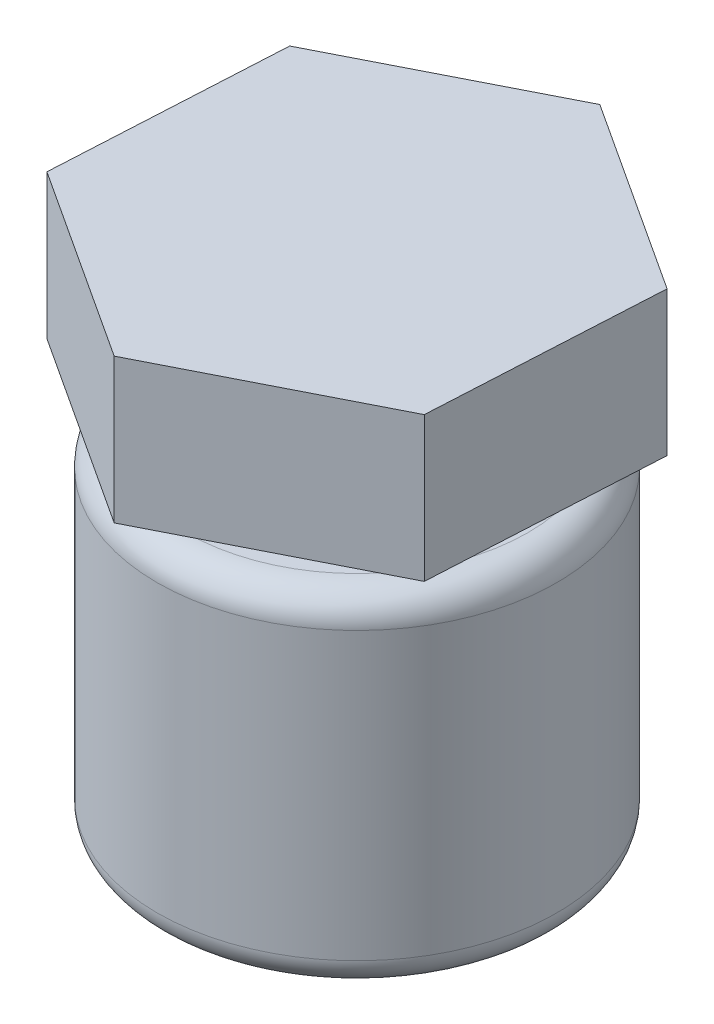
ISO-10303-21;
HEADER;
FILE_DESCRIPTION(('STEP AP214'),'2;1');
FILE_NAME('part.step','',(''),(''),'','','');
FILE_SCHEMA(('AUTOMOTIVE_DESIGN { 1 0 10303 214 1 1 1 1 }'));
ENDSEC;
DATA;
#1=APPLICATION_CONTEXT('core data for automotive mechanical design processes');
#2=APPLICATION_PROTOCOL_DEFINITION('international standard','automotive_design',2000,#1);
#3=PRODUCT_CONTEXT('',#1,'mechanical');
#4=PRODUCT('Part','Part','',(#3));
#5=PRODUCT_RELATED_PRODUCT_CATEGORY('part','',(#4));
#6=PRODUCT_DEFINITION_FORMATION('','',#4);
#7=PRODUCT_DEFINITION_CONTEXT('part definition',#1,'design');
#8=PRODUCT_DEFINITION('design','',#6,#7);
#9=PRODUCT_DEFINITION_SHAPE('','',#8);
#10=(LENGTH_UNIT() NAMED_UNIT(*) SI_UNIT(.MILLI.,.METRE.));
#11=(NAMED_UNIT(*) PLANE_ANGLE_UNIT() SI_UNIT($,.RADIAN.));
#12=(NAMED_UNIT(*) SI_UNIT($,.STERADIAN.) SOLID_ANGLE_UNIT());
#13=UNCERTAINTY_MEASURE_WITH_UNIT(LENGTH_MEASURE(1.E-05),#10,'distance_accuracy_value','');
#14=(GEOMETRIC_REPRESENTATION_CONTEXT(3) GLOBAL_UNCERTAINTY_ASSIGNED_CONTEXT((#13)) GLOBAL_UNIT_ASSIGNED_CONTEXT((#10,
#11,#12)) REPRESENTATION_CONTEXT('',''));
#15=CARTESIAN_POINT('',(0.,0.,0.));
#16=DIRECTION('',(0.,0.,1.));
#17=DIRECTION('',(1.,0.,0.));
#18=AXIS2_PLACEMENT_3D('',#15,#16,#17);
#19=CARTESIAN_POINT('',(66.8907082208874,83.6872796662249,43.6013341927026));
#20=DIRECTION('',(-0.998539035272243,0.,-0.0540351278112464));
#21=DIRECTION('',(-0.0540351278112464,0.,0.998539035272243));
#22=AXIS2_PLACEMENT_3D('',#19,#20,#21);
#23=PLANE('',#22);
#24=DIRECTION('',(0.0540351278112464,0.,-0.998539035272243));
#25=VECTOR('',#24,1.);
#26=CARTESIAN_POINT('',(66.8907082208874,33.6872796662249,43.6013341927026));
#27=LINE('',#26,#25);
#28=CARTESIAN_POINT('',(66.8907082208874,33.6872796662249,43.6013341927026));
#29=VERTEX_POINT('',#28);
#30=CARTESIAN_POINT('',(71.2052171602192,33.6872796662249,-36.1283855000698));
#31=VERTEX_POINT('',#30);
#32=EDGE_CURVE('E131',#29,#31,#27,.T.);
#33=ORIENTED_EDGE('',*,*,#32,.T.);
#34=DIRECTION('',(0.,-1.,0.));
#35=VECTOR('',#34,1.);
#36=CARTESIAN_POINT('',(71.2052171602192,83.6872796662249,-36.1283855000698));
#37=LINE('',#36,#35);
#38=CARTESIAN_POINT('',(71.2052171602192,83.6872796662249,-36.1283855000698));
#39=VERTEX_POINT('',#38);
#40=EDGE_CURVE('E12',#39,#31,#37,.T.);
#41=ORIENTED_EDGE('',*,*,#40,.F.);
#42=DIRECTION('',(0.0540351278112464,0.,-0.998539035272243));
#43=VECTOR('',#42,1.);
#44=CARTESIAN_POINT('',(66.8907082208874,83.6872796662249,43.6013341927026));
#45=LINE('',#44,#43);
#46=CARTESIAN_POINT('',(66.8907082208874,83.6872796662249,43.6013341927026));
#47=VERTEX_POINT('',#46);
#48=EDGE_CURVE('E142',#47,#39,#45,.T.);
#49=ORIENTED_EDGE('',*,*,#48,.F.);
#50=DIRECTION('',(0.,-1.,0.));
#51=VECTOR('',#50,1.);
#52=CARTESIAN_POINT('',(66.8907082208874,83.6872796662249,43.6013341927026));
#53=LINE('',#52,#51);
#54=EDGE_CURVE('E127',#47,#29,#53,.T.);
#55=ORIENTED_EDGE('',*,*,#54,.T.);
#56=EDGE_LOOP('',(#33,#41,#49,#55));
#57=FACE_BOUND('',#56,.T.);
#58=ADVANCED_FACE('F47',(#57),#23,.F.);
#59=CARTESIAN_POINT('',(71.2052171602192,83.6872796662249,-36.1283855000698));
#60=DIRECTION('',(-0.546065311017401,0.,0.837742607310545));
#61=DIRECTION('',(0.837742607310545,0.,0.546065311017401));
#62=AXIS2_PLACEMENT_3D('',#59,#60,#61);
#63=PLANE('',#62);
#64=DIRECTION('',(-0.837742607310545,0.,-0.546065311017401));
#65=VECTOR('',#64,1.);
#66=CARTESIAN_POINT('',(71.2052171602192,33.6872796662249,-36.1283855000698));
#67=LINE('',#66,#65);
#68=CARTESIAN_POINT('',(4.31450893933181,33.6872796662249,-79.7297196927724));
#69=VERTEX_POINT('',#68);
#70=EDGE_CURVE('E134',#31,#69,#67,.T.);
#71=ORIENTED_EDGE('',*,*,#70,.T.);
#72=DIRECTION('',(0.,-1.,0.));
#73=VECTOR('',#72,1.);
#74=CARTESIAN_POINT('',(4.31450893933181,83.6872796662249,-79.7297196927724));
#75=LINE('',#74,#73);
#76=CARTESIAN_POINT('',(4.31450893933181,83.6872796662249,-79.7297196927724));
#77=VERTEX_POINT('',#76);
#78=EDGE_CURVE('E55',#77,#69,#75,.T.);
#79=ORIENTED_EDGE('',*,*,#78,.F.);
#80=DIRECTION('',(-0.837742607310545,0.,-0.546065311017401));
#81=VECTOR('',#80,1.);
#82=CARTESIAN_POINT('',(71.2052171602192,83.6872796662249,-36.1283855000698));
#83=LINE('',#82,#81);
#84=EDGE_CURVE('E100',#39,#77,#83,.T.);
#85=ORIENTED_EDGE('',*,*,#84,.F.);
#86=ORIENTED_EDGE('',*,*,#40,.T.);
#87=EDGE_LOOP('',(#71,#79,#85,#86));
#88=FACE_BOUND('',#87,.T.);
#89=ADVANCED_FACE('F167',(#88),#63,.F.);
#90=CARTESIAN_POINT('',(4.31450893933181,83.6872796662249,-79.7297196927724));
#91=DIRECTION('',(0.452473724254843,0.,0.891777735121792));
#92=DIRECTION('',(0.891777735121792,0.,-0.452473724254843));
#93=AXIS2_PLACEMENT_3D('',#90,#91,#92);
#94=PLANE('',#93);
#95=DIRECTION('',(-0.891777735121792,0.,0.452473724254843));
#96=VECTOR('',#95,1.);
#97=CARTESIAN_POINT('',(4.31450893933181,33.6872796662249,-79.7297196927724));
#98=LINE('',#97,#96);
#99=CARTESIAN_POINT('',(-66.8907082208874,33.6872796662249,-43.6013341927026));
#100=VERTEX_POINT('',#99);
#101=EDGE_CURVE('E137',#69,#100,#98,.T.);
#102=ORIENTED_EDGE('',*,*,#101,.T.);
#103=DIRECTION('',(0.,-1.,0.));
#104=VECTOR('',#103,1.);
#105=CARTESIAN_POINT('',(-66.8907082208874,83.6872796662249,-43.6013341927026));
#106=LINE('',#105,#104);
#107=CARTESIAN_POINT('',(-66.8907082208874,83.6872796662249,-43.6013341927026));
#108=VERTEX_POINT('',#107);
#109=EDGE_CURVE('E122',#108,#100,#106,.T.);
#110=ORIENTED_EDGE('',*,*,#109,.F.);
#111=DIRECTION('',(-0.891777735121792,0.,0.452473724254843));
#112=VECTOR('',#111,1.);
#113=CARTESIAN_POINT('',(4.31450893933181,83.6872796662249,-79.7297196927724));
#114=LINE('',#113,#112);
#115=EDGE_CURVE('E113',#77,#108,#114,.T.);
#116=ORIENTED_EDGE('',*,*,#115,.F.);
#117=ORIENTED_EDGE('',*,*,#78,.T.);
#118=EDGE_LOOP('',(#102,#110,#116,#117));
#119=FACE_BOUND('',#118,.T.);
#120=ADVANCED_FACE('F148',(#119),#94,.F.);
#121=CARTESIAN_POINT('',(-66.8907082208874,83.6872796662249,-43.6013341927026));
#122=DIRECTION('',(0.998539035272243,0.,0.0540351278112467));
#123=DIRECTION('',(0.0540351278112468,0.,-0.998539035272243));
#124=AXIS2_PLACEMENT_3D('',#121,#122,#123);
#125=PLANE('',#124);
#126=DIRECTION('',(-0.0540351278112468,0.,0.998539035272243));
#127=VECTOR('',#126,1.);
#128=CARTESIAN_POINT('',(-66.8907082208874,33.6872796662249,-43.6013341927026));
#129=LINE('',#128,#127);
#130=CARTESIAN_POINT('',(-71.2052171602192,33.6872796662249,36.1283855000698));
#131=VERTEX_POINT('',#130);
#132=EDGE_CURVE('E121',#100,#131,#129,.T.);
#133=ORIENTED_EDGE('',*,*,#132,.T.);
#134=DIRECTION('',(0.,-1.,0.));
#135=VECTOR('',#134,1.);
#136=CARTESIAN_POINT('',(-71.2052171602192,83.6872796662249,36.1283855000698));
#137=LINE('',#136,#135);
#138=CARTESIAN_POINT('',(-71.2052171602192,83.6872796662249,36.1283855000698));
#139=VERTEX_POINT('',#138);
#140=EDGE_CURVE('E118',#139,#131,#137,.T.);
#141=ORIENTED_EDGE('',*,*,#140,.F.);
#142=DIRECTION('',(-0.0540351278112468,0.,0.998539035272243));
#143=VECTOR('',#142,1.);
#144=CARTESIAN_POINT('',(-66.8907082208874,83.6872796662249,-43.6013341927026));
#145=LINE('',#144,#143);
#146=EDGE_CURVE('E107',#108,#139,#145,.T.);
#147=ORIENTED_EDGE('',*,*,#146,.F.);
#148=ORIENTED_EDGE('',*,*,#109,.T.);
#149=EDGE_LOOP('',(#133,#141,#147,#148));
#150=FACE_BOUND('',#149,.T.);
#151=ADVANCED_FACE('F119',(#150),#125,.F.);
#152=CARTESIAN_POINT('',(-71.2052171602192,83.6872796662249,36.1283855000698));
#153=DIRECTION('',(0.5460653110174,0.,-0.837742607310545));
#154=DIRECTION('',(-0.837742607310545,0.,-0.5460653110174));
#155=AXIS2_PLACEMENT_3D('',#152,#153,#154);
#156=PLANE('',#155);
#157=DIRECTION('',(0.837742607310545,0.,0.5460653110174));
#158=VECTOR('',#157,1.);
#159=CARTESIAN_POINT('',(-71.2052171602192,33.6872796662249,36.1283855000698));
#160=LINE('',#159,#158);
#161=CARTESIAN_POINT('',(-4.31450893933173,33.6872796662249,79.7297196927724));
#162=VERTEX_POINT('',#161);
#163=EDGE_CURVE('E86',#131,#162,#160,.T.);
#164=ORIENTED_EDGE('',*,*,#163,.T.);
#165=DIRECTION('',(0.,-1.,0.));
#166=VECTOR('',#165,1.);
#167=CARTESIAN_POINT('',(-4.31450893933173,83.6872796662249,79.7297196927724));
#168=LINE('',#167,#166);
#169=CARTESIAN_POINT('',(-4.31450893933173,83.6872796662249,79.7297196927724));
#170=VERTEX_POINT('',#169);
#171=EDGE_CURVE('E123',#170,#162,#168,.T.);
#172=ORIENTED_EDGE('',*,*,#171,.F.);
#173=DIRECTION('',(0.837742607310545,0.,0.5460653110174));
#174=VECTOR('',#173,1.);
#175=CARTESIAN_POINT('',(-71.2052171602192,83.6872796662249,36.1283855000698));
#176=LINE('',#175,#174);
#177=EDGE_CURVE('E111',#139,#170,#176,.T.);
#178=ORIENTED_EDGE('',*,*,#177,.F.);
#179=ORIENTED_EDGE('',*,*,#140,.T.);
#180=EDGE_LOOP('',(#164,#172,#178,#179));
#181=FACE_BOUND('',#180,.T.);
#182=ADVANCED_FACE('F125',(#181),#156,.F.);
#183=CARTESIAN_POINT('',(-4.31450893933173,83.6872796662249,79.7297196927724));
#184=DIRECTION('',(-0.452473724254843,0.,-0.891777735121792));
#185=DIRECTION('',(-0.891777735121792,0.,0.452473724254843));
#186=AXIS2_PLACEMENT_3D('',#183,#184,#185);
#187=PLANE('',#186);
#188=DIRECTION('',(0.891777735121792,0.,-0.452473724254843));
#189=VECTOR('',#188,1.);
#190=CARTESIAN_POINT('',(-4.31450893933173,33.6872796662249,79.7297196927724));
#191=LINE('',#190,#189);
#192=EDGE_CURVE('E92',#162,#29,#191,.T.);
#193=ORIENTED_EDGE('',*,*,#192,.T.);
#194=ORIENTED_EDGE('',*,*,#54,.F.);
#195=DIRECTION('',(0.891777735121792,0.,-0.452473724254843));
#196=VECTOR('',#195,1.);
#197=CARTESIAN_POINT('',(-4.31450893933173,83.6872796662249,79.7297196927724));
#198=LINE('',#197,#196);
#199=EDGE_CURVE('E63',#170,#47,#198,.T.);
#200=ORIENTED_EDGE('',*,*,#199,.F.);
#201=ORIENTED_EDGE('',*,*,#171,.T.);
#202=EDGE_LOOP('',(#193,#194,#200,#201));
#203=FACE_BOUND('',#202,.T.);
#204=ADVANCED_FACE('F156',(#203),#187,.F.);
#205=CARTESIAN_POINT('',(0.,83.6872796662249,0.));
#206=DIRECTION('',(0.,1.,0.));
#207=DIRECTION('',(0.,0.,1.));
#208=AXIS2_PLACEMENT_3D('',#205,#206,#207);
#209=PLANE('',#208);
#210=ORIENTED_EDGE('',*,*,#48,.T.);
#211=ORIENTED_EDGE('',*,*,#84,.T.);
#212=ORIENTED_EDGE('',*,*,#115,.T.);
#213=ORIENTED_EDGE('',*,*,#146,.T.);
#214=ORIENTED_EDGE('',*,*,#177,.T.);
#215=ORIENTED_EDGE('',*,*,#199,.T.);
#216=EDGE_LOOP('',(#210,#211,#212,#213,#214,#215));
#217=FACE_BOUND('',#216,.T.);
#218=ADVANCED_FACE('F109',(#217),#209,.T.);
#219=CARTESIAN_POINT('',(0.,33.6872796662249,0.));
#220=DIRECTION('',(0.,1.,0.));
#221=DIRECTION('',(0.,0.,1.));
#222=AXIS2_PLACEMENT_3D('',#219,#220,#221);
#223=PLANE('',#222);
#224=ORIENTED_EDGE('',*,*,#32,.F.);
#225=ORIENTED_EDGE('',*,*,#192,.F.);
#226=ORIENTED_EDGE('',*,*,#163,.F.);
#227=ORIENTED_EDGE('',*,*,#132,.F.);
#228=ORIENTED_EDGE('',*,*,#101,.F.);
#229=ORIENTED_EDGE('',*,*,#70,.F.);
#230=EDGE_LOOP('',(#224,#225,#226,#227,#228,#229));
#231=FACE_BOUND('',#230,.T.);
#232=CARTESIAN_POINT('',(0.,33.6872796662249,0.));
#233=DIRECTION('',(0.,-1.,0.));
#234=DIRECTION('',(0.,0.,-1.));
#235=AXIS2_PLACEMENT_3D('',#232,#233,#234);
#236=CIRCLE('',#235,11.4938174187671);
#237=CARTESIAN_POINT('',(0.,33.6872796662249,-11.4938174187671));
#238=VERTEX_POINT('',#237);
#239=EDGE_CURVE('E252',#238,#238,#236,.T.);
#240=ORIENTED_EDGE('',*,*,#239,.F.);
#241=EDGE_LOOP('',(#240));
#242=FACE_BOUND('',#241,.T.);
#243=ADVANCED_FACE('F151',(#231,#242),#223,.F.);
#244=CARTESIAN_POINT('',(0.,55.1605805325828,0.));
#245=DIRECTION('',(0.,1.,0.));
#246=DIRECTION('',(0.,0.,1.));
#247=AXIS2_PLACEMENT_3D('',#244,#245,#246);
#248=PLANE('',#247);
#249=CARTESIAN_POINT('',(0.,55.1605805325828,0.));
#250=DIRECTION('',(0.,-1.,0.));
#251=DIRECTION('',(0.,0.,-1.));
#252=AXIS2_PLACEMENT_3D('',#249,#250,#251);
#253=CIRCLE('',#252,6.05826625521275);
#254=CARTESIAN_POINT('',(0.,55.1605805325828,-6.05826625521275));
#255=VERTEX_POINT('',#254);
#256=EDGE_CURVE('E135',#255,#255,#253,.T.);
#257=ORIENTED_EDGE('',*,*,#256,.T.);
#258=EDGE_LOOP('',(#257));
#259=FACE_BOUND('',#258,.T.);
#260=ADVANCED_FACE('F204',(#259),#248,.F.);
#261=CARTESIAN_POINT('',(0.,18.3583159974266,0.));
#262=DIRECTION('',(0.,-1.,0.));
#263=DIRECTION('',(0.,0.,-1.));
#264=AXIS2_PLACEMENT_3D('',#261,#262,#263);
#265=CYLINDRICAL_SURFACE('',#264,6.05826625521275);
#266=ORIENTED_EDGE('',*,*,#256,.F.);
#267=EDGE_LOOP('',(#266));
#268=FACE_BOUND('',#267,.T.);
#269=CARTESIAN_POINT('',(0.,45.3911254652165,0.));
#270=DIRECTION('',(0.,-1.,0.));
#271=DIRECTION('',(0.,0.,-1.));
#272=AXIS2_PLACEMENT_3D('',#269,#270,#271);
#273=CIRCLE('',#272,6.05826625521275);
#274=CARTESIAN_POINT('',(0.,45.3911254652165,-6.05826625521275));
#275=VERTEX_POINT('',#274);
#276=EDGE_CURVE('E254',#275,#275,#273,.T.);
#277=ORIENTED_EDGE('',*,*,#276,.T.);
#278=EDGE_LOOP('',(#277));
#279=FACE_BOUND('',#278,.T.);
#280=ADVANCED_FACE('F212',(#268,#279),#265,.F.);
#281=CARTESIAN_POINT('',(6.05826625521275,45.3911254652165,0.));
#282=DIRECTION('',(0.,1.,0.));
#283=DIRECTION('',(0.,0.,1.));
#284=AXIS2_PLACEMENT_3D('',#281,#282,#283);
#285=PLANE('',#284);
#286=ORIENTED_EDGE('',*,*,#276,.F.);
#287=EDGE_LOOP('',(#286));
#288=FACE_BOUND('',#287,.T.);
#289=CARTESIAN_POINT('',(0.,45.3911254652165,0.));
#290=DIRECTION('',(0.,-1.,0.));
#291=DIRECTION('',(0.,0.,-1.));
#292=AXIS2_PLACEMENT_3D('',#289,#290,#291);
#293=CIRCLE('',#292,11.4938174187671);
#294=CARTESIAN_POINT('',(0.,45.3911254652165,-11.4938174187671));
#295=VERTEX_POINT('',#294);
#296=EDGE_CURVE('E249',#295,#295,#293,.T.);
#297=ORIENTED_EDGE('',*,*,#296,.T.);
#298=EDGE_LOOP('',(#297));
#299=FACE_BOUND('',#298,.T.);
#300=ADVANCED_FACE('F222',(#288,#299),#285,.F.);
#301=CARTESIAN_POINT('',(0.,18.3583159974266,0.));
#302=DIRECTION('',(0.,-1.,0.));
#303=DIRECTION('',(0.,0.,-1.));
#304=AXIS2_PLACEMENT_3D('',#301,#302,#303);
#305=CYLINDRICAL_SURFACE('',#304,11.4938174187671);
#306=ORIENTED_EDGE('',*,*,#296,.F.);
#307=EDGE_LOOP('',(#306));
#308=FACE_BOUND('',#307,.T.);
#309=ORIENTED_EDGE('',*,*,#239,.T.);
#310=EDGE_LOOP('',(#309));
#311=FACE_BOUND('',#310,.T.);
#312=ADVANCED_FACE('F232',(#308,#311),#305,.F.);
#313=CLOSED_SHELL('',(#58,#89,#120,#151,#182,#204,#218,#243,#260,#280,#300,#312));
#314=MANIFOLD_SOLID_BREP('B2',#313);
#315=CARTESIAN_POINT('',(0.,55.1605805325828,0.));
#316=DIRECTION('',(0.,1.,0.));
#317=DIRECTION('',(0.,0.,1.));
#318=AXIS2_PLACEMENT_3D('',#315,#316,#317);
#319=PLANE('',#318);
#320=CARTESIAN_POINT('',(0.,55.1605805325828,0.));
#321=DIRECTION('',(0.,-1.,0.));
#322=DIRECTION('',(0.,0.,-1.));
#323=AXIS2_PLACEMENT_3D('',#320,#321,#322);
#324=CIRCLE('',#323,6.05826625521275);
#325=CARTESIAN_POINT('',(0.,55.1605805325828,-6.05826625521275));
#326=VERTEX_POINT('',#325);
#327=EDGE_CURVE('E305',#326,#326,#324,.T.);
#328=ORIENTED_EDGE('',*,*,#327,.F.);
#329=EDGE_LOOP('',(#328));
#330=FACE_BOUND('',#329,.T.);
#331=ADVANCED_FACE('F284',(#330),#319,.T.);
#332=CARTESIAN_POINT('',(0.,18.3583159974266,0.));
#333=DIRECTION('',(0.,-1.,0.));
#334=DIRECTION('',(0.,0.,-1.));
#335=AXIS2_PLACEMENT_3D('',#332,#333,#334);
#336=CYLINDRICAL_SURFACE('',#335,6.05826625521275);
#337=ORIENTED_EDGE('',*,*,#327,.T.);
#338=EDGE_LOOP('',(#337));
#339=FACE_BOUND('',#338,.T.);
#340=CARTESIAN_POINT('',(0.,45.3911254652165,0.));
#341=DIRECTION('',(0.,-1.,0.));
#342=DIRECTION('',(0.,0.,-1.));
#343=AXIS2_PLACEMENT_3D('',#340,#341,#342);
#344=CIRCLE('',#343,6.05826625521275);
#345=CARTESIAN_POINT('',(0.,45.3911254652165,-6.05826625521275));
#346=VERTEX_POINT('',#345);
#347=EDGE_CURVE('E308',#346,#346,#344,.T.);
#348=ORIENTED_EDGE('',*,*,#347,.F.);
#349=EDGE_LOOP('',(#348));
#350=FACE_BOUND('',#349,.T.);
#351=ADVANCED_FACE('F386',(#339,#350),#336,.T.);
#352=CARTESIAN_POINT('',(6.05826625521275,45.3911254652165,0.));
#353=DIRECTION('',(0.,1.,0.));
#354=DIRECTION('',(0.,0.,1.));
#355=AXIS2_PLACEMENT_3D('',#352,#353,#354);
#356=PLANE('',#355);
#357=ORIENTED_EDGE('',*,*,#347,.T.);
#358=EDGE_LOOP('',(#357));
#359=FACE_BOUND('',#358,.T.);
#360=CARTESIAN_POINT('',(0.,45.3911254652165,0.));
#361=DIRECTION('',(0.,-1.,0.));
#362=DIRECTION('',(0.,0.,-1.));
#363=AXIS2_PLACEMENT_3D('',#360,#361,#362);
#364=CIRCLE('',#363,11.4938174187671);
#365=CARTESIAN_POINT('',(0.,45.3911254652165,-11.4938174187671));
#366=VERTEX_POINT('',#365);
#367=EDGE_CURVE('E311',#366,#366,#364,.T.);
#368=ORIENTED_EDGE('',*,*,#367,.F.);
#369=EDGE_LOOP('',(#368));
#370=FACE_BOUND('',#369,.T.);
#371=ADVANCED_FACE('F382',(#359,#370),#356,.T.);
#372=CARTESIAN_POINT('',(0.,18.3583159974266,0.));
#373=DIRECTION('',(0.,-1.,0.));
#374=DIRECTION('',(0.,0.,-1.));
#375=AXIS2_PLACEMENT_3D('',#372,#373,#374);
#376=CYLINDRICAL_SURFACE('',#375,11.4938174187671);
#377=ORIENTED_EDGE('',*,*,#367,.T.);
#378=EDGE_LOOP('',(#377));
#379=FACE_BOUND('',#378,.T.);
#380=CARTESIAN_POINT('',(0.,33.6872796662249,0.));
#381=DIRECTION('',(0.,-1.,0.));
#382=DIRECTION('',(0.,0.,-1.));
#383=AXIS2_PLACEMENT_3D('',#380,#381,#382);
#384=CIRCLE('',#383,11.4938174187671);
#385=CARTESIAN_POINT('',(0.,33.6872796662249,-11.4938174187671));
#386=VERTEX_POINT('',#385);
#387=EDGE_CURVE('E314',#386,#386,#384,.T.);
#388=ORIENTED_EDGE('',*,*,#387,.F.);
#389=EDGE_LOOP('',(#388));
#390=FACE_BOUND('',#389,.T.);
#391=ADVANCED_FACE('F378',(#379,#390),#376,.T.);
#392=CARTESIAN_POINT('',(11.4938174187671,33.6872796662249,0.));
#393=DIRECTION('',(0.,1.,0.));
#394=DIRECTION('',(0.,0.,1.));
#395=AXIS2_PLACEMENT_3D('',#392,#393,#394);
#396=PLANE('',#395);
#397=ORIENTED_EDGE('',*,*,#387,.T.);
#398=EDGE_LOOP('',(#397));
#399=FACE_BOUND('',#398,.T.);
#400=CARTESIAN_POINT('',(0.,33.6872796662249,0.));
#401=DIRECTION('',(0.,-1.,0.));
#402=DIRECTION('',(0.,0.,-1.));
#403=AXIS2_PLACEMENT_3D('',#400,#401,#402);
#404=CIRCLE('',#403,12.6180091564788);
#405=CARTESIAN_POINT('',(0.,33.6872796662249,-12.6180091564788));
#406=VERTEX_POINT('',#405);
#407=EDGE_CURVE('E317',#406,#406,#404,.T.);
#408=ORIENTED_EDGE('',*,*,#407,.F.);
#409=EDGE_LOOP('',(#408));
#410=FACE_BOUND('',#409,.T.);
#411=ADVANCED_FACE('F374',(#399,#410),#396,.T.);
#412=CARTESIAN_POINT('',(0.,18.3583159974266,0.));
#413=DIRECTION('',(0.,-1.,0.));
#414=DIRECTION('',(0.,0.,-1.));
#415=AXIS2_PLACEMENT_3D('',#412,#413,#414);
#416=CYLINDRICAL_SURFACE('',#415,12.6180091564788);
#417=ORIENTED_EDGE('',*,*,#407,.T.);
#418=EDGE_LOOP('',(#417));
#419=FACE_BOUND('',#418,.T.);
#420=CARTESIAN_POINT('',(0.,32.5134597628738,0.));
#421=DIRECTION('',(0.,-1.,0.));
#422=DIRECTION('',(0.,0.,-1.));
#423=AXIS2_PLACEMENT_3D('',#420,#421,#422);
#424=CIRCLE('',#423,12.6180091564788);
#425=CARTESIAN_POINT('',(0.,32.5134597628738,-12.6180091564788));
#426=VERTEX_POINT('',#425);
#427=EDGE_CURVE('E320',#426,#426,#424,.T.);
#428=ORIENTED_EDGE('',*,*,#427,.F.);
#429=EDGE_LOOP('',(#428));
#430=FACE_BOUND('',#429,.T.);
#431=ADVANCED_FACE('F370',(#419,#430),#416,.T.);
#432=CARTESIAN_POINT('',(12.6180091564788,32.5134597628738,0.));
#433=DIRECTION('',(0.,-1.,0.));
#434=DIRECTION('',(0.,0.,-1.));
#435=AXIS2_PLACEMENT_3D('',#432,#433,#434);
#436=PLANE('',#435);
#437=ORIENTED_EDGE('',*,*,#427,.T.);
#438=EDGE_LOOP('',(#437));
#439=FACE_BOUND('',#438,.T.);
#440=CARTESIAN_POINT('',(0.,32.5134597628738,0.));
#441=DIRECTION('',(0.,-1.,0.));
#442=DIRECTION('',(0.,0.,-1.));
#443=AXIS2_PLACEMENT_3D('',#440,#441,#442);
#444=CIRCLE('',#443,11.4938174187671);
#445=CARTESIAN_POINT('',(0.,32.5134597628738,-11.4938174187671));
#446=VERTEX_POINT('',#445);
#447=EDGE_CURVE('E323',#446,#446,#444,.T.);
#448=ORIENTED_EDGE('',*,*,#447,.F.);
#449=EDGE_LOOP('',(#448));
#450=FACE_BOUND('',#449,.T.);
#451=ADVANCED_FACE('F366',(#439,#450),#436,.T.);
#452=CARTESIAN_POINT('',(0.,18.3583159974266,0.));
#453=DIRECTION('',(0.,-1.,0.));
#454=DIRECTION('',(0.,0.,-1.));
#455=AXIS2_PLACEMENT_3D('',#452,#453,#454);
#456=CYLINDRICAL_SURFACE('',#455,11.4938174187671);
#457=ORIENTED_EDGE('',*,*,#447,.T.);
#458=EDGE_LOOP('',(#457));
#459=FACE_BOUND('',#458,.T.);
#460=CARTESIAN_POINT('',(0.,22.6219746146796,0.));
#461=DIRECTION('',(0.,-1.,0.));
#462=DIRECTION('',(0.,0.,-1.));
#463=AXIS2_PLACEMENT_3D('',#460,#461,#462);
#464=CIRCLE('',#463,11.4938174187671);
#465=CARTESIAN_POINT('',(0.,22.6219746146796,-11.4938174187671));
#466=VERTEX_POINT('',#465);
#467=EDGE_CURVE('E326',#466,#466,#464,.T.);
#468=ORIENTED_EDGE('',*,*,#467,.F.);
#469=EDGE_LOOP('',(#468));
#470=FACE_BOUND('',#469,.T.);
#471=ADVANCED_FACE('F362',(#459,#470),#456,.T.);
#472=CARTESIAN_POINT('',(11.4938174187671,22.6219746146796,0.));
#473=DIRECTION('',(0.,1.,0.));
#474=DIRECTION('',(0.,0.,1.));
#475=AXIS2_PLACEMENT_3D('',#472,#473,#474);
#476=PLANE('',#475);
#477=CARTESIAN_POINT('',(0.,22.6219746146796,0.));
#478=DIRECTION('',(0.,1.,0.));
#479=DIRECTION('',(0.,0.,1.));
#480=AXIS2_PLACEMENT_3D('',#477,#478,#479);
#481=CIRCLE('',#480,59.1489869214056);
#482=CARTESIAN_POINT('',(0.,22.6219746146796,59.1489869214056));
#483=VERTEX_POINT('',#482);
#484=EDGE_CURVE('E296',#483,#483,#481,.T.);
#485=ORIENTED_EDGE('',*,*,#484,.T.);
#486=EDGE_LOOP('',(#485));
#487=FACE_BOUND('',#486,.T.);
#488=ORIENTED_EDGE('',*,*,#467,.T.);
#489=EDGE_LOOP('',(#488));
#490=FACE_BOUND('',#489,.T.);
#491=ADVANCED_FACE('F359',(#487,#490),#476,.T.);
#492=CARTESIAN_POINT('',(0.,18.3583159974266,0.));
#493=DIRECTION('',(0.,-1.,0.));
#494=DIRECTION('',(0.,0.,-1.));
#495=AXIS2_PLACEMENT_3D('',#492,#493,#494);
#496=CYLINDRICAL_SURFACE('',#495,69.1489869214056);
#497=CARTESIAN_POINT('',(0.,-86.3701803654772,0.));
#498=DIRECTION('',(0.,-1.,0.));
#499=DIRECTION('',(0.,0.,-1.));
#500=AXIS2_PLACEMENT_3D('',#497,#498,#499);
#501=CIRCLE('',#500,69.1489869214056);
#502=CARTESIAN_POINT('',(0.,-86.3701803654772,-69.1489869214056));
#503=VERTEX_POINT('',#502);
#504=EDGE_CURVE('E46',#503,#503,#501,.F.);
#505=ORIENTED_EDGE('',*,*,#504,.T.);
#506=EDGE_LOOP('',(#505));
#507=FACE_BOUND('',#506,.T.);
#508=CARTESIAN_POINT('',(0.,12.6219746146796,0.));
#509=DIRECTION('',(0.,1.,0.));
#510=DIRECTION('',(0.,0.,1.));
#511=AXIS2_PLACEMENT_3D('',#508,#509,#510);
#512=CIRCLE('',#511,69.1489869214056);
#513=CARTESIAN_POINT('',(0.,12.6219746146796,69.1489869214056));
#514=VERTEX_POINT('',#513);
#515=EDGE_CURVE('E300',#514,#514,#512,.F.);
#516=ORIENTED_EDGE('',*,*,#515,.T.);
#517=EDGE_LOOP('',(#516));
#518=FACE_BOUND('',#517,.T.);
#519=ADVANCED_FACE('F356',(#507,#518),#496,.T.);
#520=CARTESIAN_POINT('',(69.1489869214056,-96.3701803654772,0.));
#521=DIRECTION('',(0.,-1.,0.));
#522=DIRECTION('',(0.,0.,-1.));
#523=AXIS2_PLACEMENT_3D('',#520,#521,#522);
#524=PLANE('',#523);
#525=CARTESIAN_POINT('',(0.,-96.3701803654772,0.));
#526=DIRECTION('',(0.,-1.,0.));
#527=DIRECTION('',(0.,0.,-1.));
#528=AXIS2_PLACEMENT_3D('',#525,#526,#527);
#529=CIRCLE('',#528,59.1489869214056);
#530=CARTESIAN_POINT('',(0.,-96.3701803654772,-59.1489869214056));
#531=VERTEX_POINT('',#530);
#532=EDGE_CURVE('E292',#531,#531,#529,.T.);
#533=ORIENTED_EDGE('',*,*,#532,.T.);
#534=EDGE_LOOP('',(#533));
#535=FACE_BOUND('',#534,.T.);
#536=ADVANCED_FACE('F352',(#535),#524,.T.);
#537=CARTESIAN_POINT('',(0.,12.6219746146796,0.));
#538=DIRECTION('',(0.,1.,0.));
#539=DIRECTION('',(0.,0.,1.));
#540=AXIS2_PLACEMENT_3D('',#537,#538,#539);
#541=TOROIDAL_SURFACE('',#540,59.1489869214056,10.);
#542=ORIENTED_EDGE('',*,*,#484,.F.);
#543=EDGE_LOOP('',(#542));
#544=FACE_BOUND('',#543,.T.);
#545=ORIENTED_EDGE('',*,*,#515,.F.);
#546=EDGE_LOOP('',(#545));
#547=FACE_BOUND('',#546,.T.);
#548=ADVANCED_FACE('F355',(#544,#547),#541,.T.);
#549=CARTESIAN_POINT('',(0.,-86.3701803654772,0.));
#550=DIRECTION('',(0.,-1.,0.));
#551=DIRECTION('',(0.,0.,-1.));
#552=AXIS2_PLACEMENT_3D('',#549,#550,#551);
#553=TOROIDAL_SURFACE('',#552,59.1489869214056,10.);
#554=ORIENTED_EDGE('',*,*,#504,.F.);
#555=EDGE_LOOP('',(#554));
#556=FACE_BOUND('',#555,.T.);
#557=ORIENTED_EDGE('',*,*,#532,.F.);
#558=EDGE_LOOP('',(#557));
#559=FACE_BOUND('',#558,.T.);
#560=ADVANCED_FACE('F286',(#556,#559),#553,.T.);
#561=CLOSED_SHELL('',(#331,#351,#371,#391,#411,#431,#451,#471,#491,#519,#536,#548,#560));
#562=CARTESIAN_POINT('',(0.,-81.6999791912042,0.));
#563=DIRECTION('',(0.,1.,0.));
#564=DIRECTION('',(0.,0.,1.));
#565=AXIS2_PLACEMENT_3D('',#562,#563,#564);
#566=PLANE('',#565);
#567=CARTESIAN_POINT('',(0.,-81.6999791912042,0.));
#568=DIRECTION('',(0.,-1.,0.));
#569=DIRECTION('',(0.,0.,-1.));
#570=AXIS2_PLACEMENT_3D('',#567,#568,#569);
#571=CIRCLE('',#570,63.1286840758578);
#572=CARTESIAN_POINT('',(0.,-81.6999791912042,-63.1286840758578));
#573=VERTEX_POINT('',#572);
#574=EDGE_CURVE('E329',#573,#573,#571,.T.);
#575=ORIENTED_EDGE('',*,*,#574,.F.);
#576=EDGE_LOOP('',(#575));
#577=FACE_BOUND('',#576,.T.);
#578=ADVANCED_FACE('F340',(#577),#566,.T.);
#579=CARTESIAN_POINT('',(0.,18.3583159974266,0.));
#580=DIRECTION('',(0.,-1.,0.));
#581=DIRECTION('',(0.,0.,-1.));
#582=AXIS2_PLACEMENT_3D('',#579,#580,#581);
#583=CYLINDRICAL_SURFACE('',#582,63.1286840758578);
#584=ORIENTED_EDGE('',*,*,#574,.T.);
#585=EDGE_LOOP('',(#584));
#586=FACE_BOUND('',#585,.T.);
#587=CARTESIAN_POINT('',(0.,18.3583159974266,0.));
#588=DIRECTION('',(0.,-1.,0.));
#589=DIRECTION('',(0.,0.,-1.));
#590=AXIS2_PLACEMENT_3D('',#587,#588,#589);
#591=CIRCLE('',#590,63.1286840758578);
#592=CARTESIAN_POINT('',(0.,18.3583159974266,-63.1286840758578));
#593=VERTEX_POINT('',#592);
#594=EDGE_CURVE('E332',#593,#593,#591,.T.);
#595=ORIENTED_EDGE('',*,*,#594,.F.);
#596=EDGE_LOOP('',(#595));
#597=FACE_BOUND('',#596,.T.);
#598=ADVANCED_FACE('F338',(#586,#597),#583,.F.);
#599=CARTESIAN_POINT('',(5.35159125536561,18.3583159974266,0.));
#600=DIRECTION('',(0.,-1.,0.));
#601=DIRECTION('',(0.,0.,-1.));
#602=AXIS2_PLACEMENT_3D('',#599,#600,#601);
#603=PLANE('',#602);
#604=ORIENTED_EDGE('',*,*,#594,.T.);
#605=EDGE_LOOP('',(#604));
#606=FACE_BOUND('',#605,.T.);
#607=ADVANCED_FACE('F336',(#606),#603,.T.);
#608=CLOSED_SHELL('',(#578,#598,#607));
#609=ORIENTED_CLOSED_SHELL('',*,#608,.T.);
#610=BREP_WITH_VOIDS('B6',#561,(#609));
#611=ADVANCED_BREP_SHAPE_REPRESENTATION('',(#18,#314,#610),#14);
#612=SHAPE_DEFINITION_REPRESENTATION(#9,#611);
ENDSEC;
END-ISO-10303-21;
